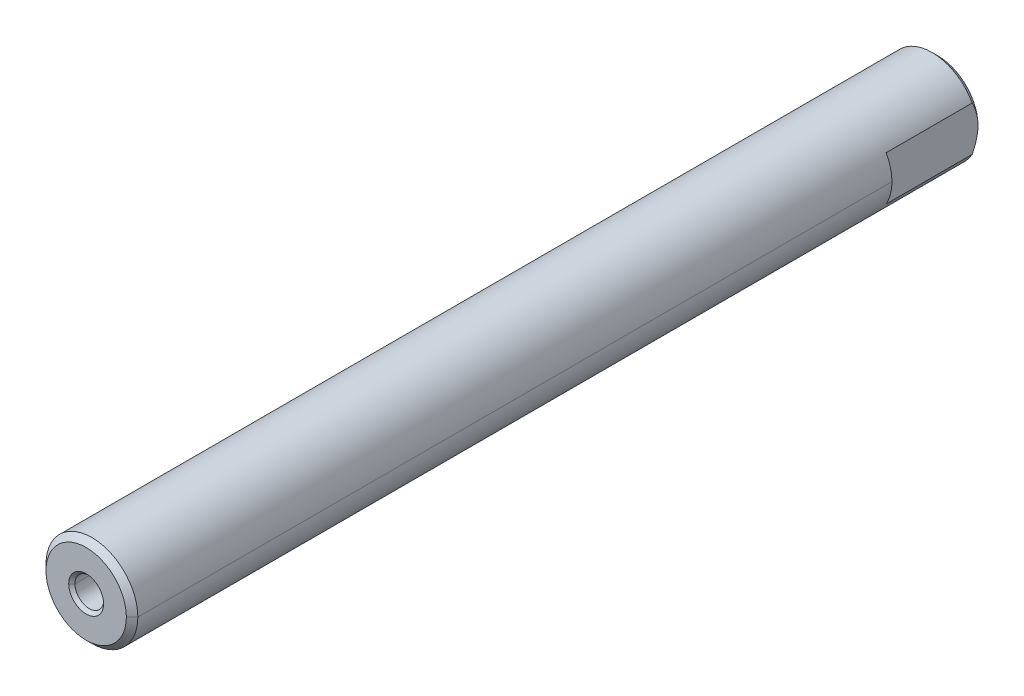
ISO-10303-21;
HEADER;
FILE_DESCRIPTION(('STEP AP214'),'2;1');
FILE_NAME('part.step','',(''),(''),'','','');
FILE_SCHEMA(('AUTOMOTIVE_DESIGN { 1 0 10303 214 1 1 1 1 }'));
ENDSEC;
DATA;
#1=APPLICATION_CONTEXT('core data for automotive mechanical design processes');
#2=APPLICATION_PROTOCOL_DEFINITION('international standard','automotive_design',2000,#1);
#3=PRODUCT_CONTEXT('',#1,'mechanical');
#4=PRODUCT('Part','Part','',(#3));
#5=PRODUCT_RELATED_PRODUCT_CATEGORY('part','',(#4));
#6=PRODUCT_DEFINITION_FORMATION('','',#4);
#7=PRODUCT_DEFINITION_CONTEXT('part definition',#1,'design');
#8=PRODUCT_DEFINITION('design','',#6,#7);
#9=PRODUCT_DEFINITION_SHAPE('','',#8);
#10=(LENGTH_UNIT() NAMED_UNIT(*) SI_UNIT(.MILLI.,.METRE.));
#11=(NAMED_UNIT(*) PLANE_ANGLE_UNIT() SI_UNIT($,.RADIAN.));
#12=(NAMED_UNIT(*) SI_UNIT($,.STERADIAN.) SOLID_ANGLE_UNIT());
#13=UNCERTAINTY_MEASURE_WITH_UNIT(LENGTH_MEASURE(1.E-05),#10,'distance_accuracy_value','');
#14=(GEOMETRIC_REPRESENTATION_CONTEXT(3) GLOBAL_UNCERTAINTY_ASSIGNED_CONTEXT((#13)) GLOBAL_UNIT_ASSIGNED_CONTEXT((#10,
#11,#12)) REPRESENTATION_CONTEXT('',''));
#15=CARTESIAN_POINT('',(0.,0.,0.));
#16=DIRECTION('',(0.,0.,1.));
#17=DIRECTION('',(1.,0.,0.));
#18=AXIS2_PLACEMENT_3D('',#15,#16,#17);
#19=CARTESIAN_POINT('',(3.5,4.88621935412864,8.));
#20=DIRECTION('',(1.,0.,0.));
#21=DIRECTION('',(0.,-1.,0.));
#22=AXIS2_PLACEMENT_3D('',#19,#20,#21);
#23=PLANE('',#22);
#24=DIRECTION('',(0.,0.,-1.));
#25=VECTOR('',#24,1.);
#26=CARTESIAN_POINT('',(3.5,-1.93649167310371,74.2));
#27=LINE('',#26,#25);
#28=CARTESIAN_POINT('',(3.5,-1.93649167310371,8.));
#29=VERTEX_POINT('',#28);
#30=CARTESIAN_POINT('',(3.5,-1.93649167310371,0.499999999999973));
#31=VERTEX_POINT('',#30);
#32=EDGE_CURVE('E265',#29,#31,#27,.T.);
#33=ORIENTED_EDGE('',*,*,#32,.T.);
#34=CARTESIAN_POINT('',(3.50000000000001,0.,0.));
#35=CARTESIAN_POINT('',(3.49999423419563,-0.0555619538931981,-1.30702272804487E-05));
#36=CARTESIAN_POINT('',(3.49999572668385,-0.111121671783046,0.00131852479239465));
#37=CARTESIAN_POINT('',(3.50000799050671,-0.222251276917325,0.00661908997412815));
#38=CARTESIAN_POINT('',(3.50001878444004,-0.277820859117804,0.0105944780899242));
#39=CARTESIAN_POINT('',(3.50004450680793,-0.389217556622177,0.0211781292324958));
#40=CARTESIAN_POINT('',(3.50005947197903,-0.44504241252961,0.027810026398505));
#41=CARTESIAN_POINT('',(3.5000592182873,-0.555633468361458,0.0434708609194682));
#42=CARTESIAN_POINT('',(3.50004437853917,-0.610404130825067,0.0524684418747022));
#43=CARTESIAN_POINT('',(3.50001919201908,-0.719999500201629,0.0728991674521169));
#44=CARTESIAN_POINT('',(3.50000888698394,-0.774820237879889,0.0843535501567228));
#45=CARTESIAN_POINT('',(3.50000115732277,-0.884720239033222,0.109686665736703));
#46=CARTESIAN_POINT('',(3.50000391844677,-0.939792043412603,0.123597637422184));
#47=CARTESIAN_POINT('',(3.4999962999565,-1.04630054982994,0.152703499743443));
#48=CARTESIAN_POINT('',(3.49998664419242,-1.09776877426685,0.167783612006304));
#49=CARTESIAN_POINT('',(3.49996326392631,-1.20089778451889,0.199927441463297));
#50=CARTESIAN_POINT('',(3.49994948262978,-1.25255060021617,0.217016680077174));
#51=CARTESIAN_POINT('',(3.49993156376901,-1.35617637628908,0.253176782737059));
#52=CARTESIAN_POINT('',(3.49992760005002,-1.40813899390018,0.272277208932558));
#53=CARTESIAN_POINT('',(3.49993019638396,-1.51250518018962,0.312455524133317));
#54=CARTESIAN_POINT('',(3.49993697160376,-1.56489630237242,0.333565673389017));
#55=CARTESIAN_POINT('',(3.49995658221961,-1.67023045290739,0.377760651519771));
#56=CARTESIAN_POINT('',(3.49996955094998,-1.72315924712703,0.400879296630532));
#57=CARTESIAN_POINT('',(3.49999114662072,-1.8296726293535,0.449092869420737));
#58=CARTESIAN_POINT('',(3.49999965968975,-1.88324162537189,0.474222290336471));
#59=CARTESIAN_POINT('',(3.5,-1.9364916731037,0.499999999999973));
#60=B_SPLINE_CURVE_WITH_KNOTS('',3,(#34,#35,#36,#37,#38,#39,#40,#41,#42,#43,#44,#45,#46,#47,#48,
#49,#50,#51,#52,#53,#54,#55,#56,#57,#58,#59),.UNSPECIFIED.,.F.,.F.,(4,2,2,2,2,2,2,2,2,2,2,2,4),
(0.,0.166666050409908,0.333738175953032,0.50233093054408,0.668792788664151,0.836756231229519,
1.00711457609173,1.16797762335634,1.33116587893333,1.49722377747284,1.66665111117858,
1.83990264037783,2.01738884059159),.UNSPECIFIED.);
#61=CARTESIAN_POINT('',(3.5,0.,0.));
#62=VERTEX_POINT('',#61);
#63=EDGE_CURVE('E51',#62,#31,#60,.T.);
#64=ORIENTED_EDGE('',*,*,#63,.F.);
#65=CARTESIAN_POINT('',(3.49999999999964,1.93649167310487,0.50000000000022));
#66=CARTESIAN_POINT('',(3.49999633796739,1.85725073251925,0.461643561513582));
#67=CARTESIAN_POINT('',(3.49998014987614,1.77729228376843,0.424713309217899));
#68=CARTESIAN_POINT('',(3.49994945600058,1.61864369550092,0.355478896279895));
#69=CARTESIAN_POINT('',(3.49993491163559,1.54000355663815,0.323059791368621));
#70=CARTESIAN_POINT('',(3.49993056595057,1.38363011274416,0.262831423625443));
#71=CARTESIAN_POINT('',(3.49994004639097,1.30593864552105,0.234914272908432));
#72=CARTESIAN_POINT('',(3.49998004272987,1.15106355267432,0.183693271237866));
#73=CARTESIAN_POINT('',(3.50001005861703,1.07391096267743,0.160296356994423));
#74=CARTESIAN_POINT('',(3.49999457224081,0.954244897451044,0.12752215635419));
#75=CARTESIAN_POINT('',(3.49997747550548,0.912136997920225,0.116649537344117));
#76=CARTESIAN_POINT('',(3.49992408533141,0.828273762023762,0.0963700135038604));
#77=CARTESIAN_POINT('',(3.49988810032696,0.786523409588376,0.0869426158519951));
#78=CARTESIAN_POINT('',(3.49982274348452,0.70328576035035,0.0695567359411578));
#79=CARTESIAN_POINT('',(3.49979329148949,0.661802138465579,0.0615806933900689));
#80=CARTESIAN_POINT('',(3.49975199189934,0.579005667526155,0.0470927424214977));
#81=CARTESIAN_POINT('',(3.49973997165639,0.537695241671709,0.0405670248487049));
#82=CARTESIAN_POINT('',(3.49973858613407,0.455150110797609,0.0289762346599651));
#83=CARTESIAN_POINT('',(3.49974907048804,0.413916734200623,0.0239017225160791));
#84=CARTESIAN_POINT('',(3.49978885777352,0.331428306804682,0.015208336579315));
#85=CARTESIAN_POINT('',(3.4998181011143,0.290173736525271,0.0115849121837062));
#86=CARTESIAN_POINT('',(3.49988377923512,0.207543637941627,0.00578988180787202));
#87=CARTESIAN_POINT('',(3.49992021733093,0.166168062565514,0.0036189472500192));
#88=CARTESIAN_POINT('',(3.49997761254116,0.0831949939432194,0.000719101244980721));
#89=CARTESIAN_POINT('',(3.49999850500249,0.0415972906389801,-3.80881945210407E-06));
#90=CARTESIAN_POINT('',(3.50000000000001,0.,0.));
#91=B_SPLINE_CURVE_WITH_KNOTS('',3,(#65,#66,#67,#68,#69,#70,#71,#72,#73,#74,#75,#76,#77,#78,#79,
#80,#81,#82,#83,#84,#85,#86,#87,#88,#89,#90),.UNSPECIFIED.,.F.,.F.,(4,2,2,2,2,2,2,2,2,2,2,2,4),
(0.,0.264129868688764,0.519235667288116,0.76680540986096,1.00855216360746,1.13900182260933,
1.26738470409587,1.39409256107915,1.51953669763116,1.64414527718691,1.76835996604413,
1.89263203430834,2.01741809508854),.UNSPECIFIED.);
#92=CARTESIAN_POINT('',(3.5,1.93649167310507,0.499999999999808));
#93=VERTEX_POINT('',#92);
#94=EDGE_CURVE('E264',#93,#62,#91,.T.);
#95=ORIENTED_EDGE('',*,*,#94,.F.);
#96=DIRECTION('',(0.,0.,1.));
#97=VECTOR('',#96,1.);
#98=CARTESIAN_POINT('',(3.5,1.93649167310371,74.2));
#99=LINE('',#98,#97);
#100=CARTESIAN_POINT('',(3.5,1.93649167310371,8.));
#101=VERTEX_POINT('',#100);
#102=EDGE_CURVE('E243',#93,#101,#99,.T.);
#103=ORIENTED_EDGE('',*,*,#102,.T.);
#104=DIRECTION('',(0.,-1.,0.));
#105=VECTOR('',#104,1.);
#106=CARTESIAN_POINT('',(3.5,4.88621935412864,8.));
#107=LINE('',#106,#105);
#108=EDGE_CURVE('E9',#101,#29,#107,.T.);
#109=ORIENTED_EDGE('',*,*,#108,.T.);
#110=EDGE_LOOP('',(#33,#64,#95,#103,#109));
#111=FACE_BOUND('',#110,.T.);
#112=ADVANCED_FACE('F15',(#111),#23,.T.);
#113=CARTESIAN_POINT('',(0.,0.,8.));
#114=DIRECTION('',(0.,0.,-1.));
#115=DIRECTION('',(0.,-1.,0.));
#116=AXIS2_PLACEMENT_3D('',#113,#114,#115);
#117=PLANE('',#116);
#118=CARTESIAN_POINT('',(0.,0.,8.));
#119=DIRECTION('',(0.,0.,-1.));
#120=DIRECTION('',(-1.,0.,0.));
#121=AXIS2_PLACEMENT_3D('',#118,#119,#120);
#122=CIRCLE('',#121,4.);
#123=CARTESIAN_POINT('',(4.,0.,8.));
#124=VERTEX_POINT('',#123);
#125=EDGE_CURVE('E239',#101,#124,#122,.T.);
#126=ORIENTED_EDGE('',*,*,#125,.T.);
#127=CARTESIAN_POINT('',(0.,0.,8.));
#128=DIRECTION('',(0.,0.,-1.));
#129=DIRECTION('',(-1.,0.,0.));
#130=AXIS2_PLACEMENT_3D('',#127,#128,#129);
#131=CIRCLE('',#130,4.);
#132=EDGE_CURVE('E260',#124,#29,#131,.T.);
#133=ORIENTED_EDGE('',*,*,#132,.T.);
#134=ORIENTED_EDGE('',*,*,#108,.F.);
#135=EDGE_LOOP('',(#126,#133,#134));
#136=FACE_BOUND('',#135,.T.);
#137=ADVANCED_FACE('F446',(#136),#117,.T.);
#138=CARTESIAN_POINT('',(0.,0.,8.));
#139=DIRECTION('',(0.,0.,-1.));
#140=DIRECTION('',(0.,-1.,0.));
#141=AXIS2_PLACEMENT_3D('',#138,#139,#140);
#142=PLANE('',#141);
#143=CARTESIAN_POINT('',(0.,0.,8.));
#144=DIRECTION('',(0.,0.,-1.));
#145=DIRECTION('',(-1.,0.,0.));
#146=AXIS2_PLACEMENT_3D('',#143,#144,#145);
#147=CIRCLE('',#146,4.);
#148=CARTESIAN_POINT('',(-3.5,-1.93649167310371,8.));
#149=VERTEX_POINT('',#148);
#150=CARTESIAN_POINT('',(-4.,0.,8.));
#151=VERTEX_POINT('',#150);
#152=EDGE_CURVE('E256',#149,#151,#147,.T.);
#153=ORIENTED_EDGE('',*,*,#152,.T.);
#154=CARTESIAN_POINT('',(0.,0.,8.));
#155=DIRECTION('',(0.,0.,-1.));
#156=DIRECTION('',(-1.,0.,0.));
#157=AXIS2_PLACEMENT_3D('',#154,#155,#156);
#158=CIRCLE('',#157,4.);
#159=CARTESIAN_POINT('',(-3.5,1.93649167310371,8.));
#160=VERTEX_POINT('',#159);
#161=EDGE_CURVE('E244',#151,#160,#158,.T.);
#162=ORIENTED_EDGE('',*,*,#161,.T.);
#163=DIRECTION('',(0.,1.,0.));
#164=VECTOR('',#163,1.);
#165=CARTESIAN_POINT('',(-3.5,4.88621935412864,8.));
#166=LINE('',#165,#164);
#167=EDGE_CURVE('E25',#149,#160,#166,.T.);
#168=ORIENTED_EDGE('',*,*,#167,.F.);
#169=EDGE_LOOP('',(#153,#162,#168));
#170=FACE_BOUND('',#169,.T.);
#171=ADVANCED_FACE('F407',(#170),#142,.T.);
#172=CARTESIAN_POINT('',(-3.5,4.88621935412864,8.));
#173=DIRECTION('',(-1.,0.,0.));
#174=DIRECTION('',(0.,0.,1.));
#175=AXIS2_PLACEMENT_3D('',#172,#173,#174);
#176=PLANE('',#175);
#177=DIRECTION('',(0.,0.,-1.));
#178=VECTOR('',#177,1.);
#179=CARTESIAN_POINT('',(-3.5,1.93649167310371,74.2));
#180=LINE('',#179,#178);
#181=CARTESIAN_POINT('',(-3.5,1.93649167310371,0.499999999999973));
#182=VERTEX_POINT('',#181);
#183=EDGE_CURVE('E249',#160,#182,#180,.T.);
#184=ORIENTED_EDGE('',*,*,#183,.T.);
#185=CARTESIAN_POINT('',(-3.50000000000001,0.,0.));
#186=CARTESIAN_POINT('',(-3.49999423419563,0.05556195389349,-1.3070227285935E-05));
#187=CARTESIAN_POINT('',(-3.49999572668383,0.111121671783623,0.00131852479238515));
#188=CARTESIAN_POINT('',(-3.50000799050666,0.222251276918185,0.00661908997412416));
#189=CARTESIAN_POINT('',(-3.50001878443996,0.277820859118661,0.0105944780899161));
#190=CARTESIAN_POINT('',(-3.50004450680784,0.389217556622746,0.021178129232478));
#191=CARTESIAN_POINT('',(-3.50005947197896,0.445042412529893,0.0278100263984686));
#192=CARTESIAN_POINT('',(-3.50005921828738,0.555633468359552,0.0434708609192792));
#193=CARTESIAN_POINT('',(-3.50004437853941,0.610404130821268,0.0524684418743068));
#194=CARTESIAN_POINT('',(-3.50001919201962,0.719999500195927,0.0728991674514993));
#195=CARTESIAN_POINT('',(-3.50000888698464,0.774820237874163,0.0843535501561695));
#196=CARTESIAN_POINT('',(-3.50000115732337,0.884720239029402,0.109686665736321));
#197=CARTESIAN_POINT('',(-3.5000039184471,0.939792043410694,0.123597637421981));
#198=CARTESIAN_POINT('',(-3.49999629995618,1.04630054982861,0.152703499742774));
#199=CARTESIAN_POINT('',(-3.49998664419173,1.09776877426421,0.167783612004871));
#200=CARTESIAN_POINT('',(-3.49996326392519,1.20089778451411,0.199927441460693));
#201=CARTESIAN_POINT('',(-3.49994948262861,1.25255060021055,0.217016680074183));
#202=CARTESIAN_POINT('',(-3.49993156376785,1.3561763762823,0.253176782733528));
#203=CARTESIAN_POINT('',(-3.49992760004892,1.40813899389308,0.272277208928893));
#204=CARTESIAN_POINT('',(-3.49993019638307,1.51250518018245,0.312455524129651));
#205=CARTESIAN_POINT('',(-3.49993697160302,1.56489630236548,0.333565673385505));
#206=CARTESIAN_POINT('',(-3.49995658221916,1.6702304529015,0.377760651516822));
#207=CARTESIAN_POINT('',(-3.49996955094968,1.72315924712196,0.400879296628012));
#208=CARTESIAN_POINT('',(-3.49999114662065,1.82967262935066,0.449092869419339));
#209=CARTESIAN_POINT('',(-3.49999965968974,1.88324162537047,0.474222290335783));
#210=CARTESIAN_POINT('',(-3.5,1.93649167310371,0.499999999999973));
#211=B_SPLINE_CURVE_WITH_KNOTS('',3,(#185,#186,#187,#188,#189,#190,#191,#192,#193,#194,#195,
#196,#197,#198,#199,#200,#201,#202,#203,#204,#205,#206,#207,#208,#209,#210),.UNSPECIFIED.,.F.,
.F.,(4,2,2,2,2,2,2,2,2,2,2,2,4),(0.,0.166666050410762,0.333738175953879,0.502330930544067,
0.668792788658431,0.836756231223779,1.0071145760917,1.1679776233519,1.33116587892611,
1.49722377746459,1.66665111117115,1.83990264037315,2.01738884059166),.UNSPECIFIED.);
#212=CARTESIAN_POINT('',(-3.5,0.,0.));
#213=VERTEX_POINT('',#212);
#214=EDGE_CURVE('E334',#213,#182,#211,.T.);
#215=ORIENTED_EDGE('',*,*,#214,.F.);
#216=CARTESIAN_POINT('',(-3.49999999999964,-1.93649167310488,0.500000000000221));
#217=CARTESIAN_POINT('',(-3.49999633796739,-1.85725073252099,0.461643561514421));
#218=CARTESIAN_POINT('',(-3.4999801498763,-1.77729228377189,0.424713309219631));
#219=CARTESIAN_POINT('',(-3.49994945600111,-1.61864369550664,0.355478896282779));
#220=CARTESIAN_POINT('',(-3.49993491163634,-1.54000355664437,0.323059791371818));
#221=CARTESIAN_POINT('',(-3.49993056595163,-1.38363011275029,0.262831423628666));
#222=CARTESIAN_POINT('',(-3.49994004639212,-1.30593864552655,0.234914272911425));
#223=CARTESIAN_POINT('',(-3.49998004273072,-1.15106355267759,0.183693271239671));
#224=CARTESIAN_POINT('',(-3.5000100586175,-1.07391096267908,0.160296356995333));
#225=CARTESIAN_POINT('',(-3.49999457224055,-0.954244897452035,0.127522156354212));
#226=CARTESIAN_POINT('',(-3.49997747550493,-0.912136997922215,0.116649537344102));
#227=CARTESIAN_POINT('',(-3.49992408533048,-0.828273762027455,0.0963700135038158));
#228=CARTESIAN_POINT('',(-3.49988810032593,-0.786523409592771,0.0869426158519643));
#229=CARTESIAN_POINT('',(-3.49982274348338,-0.703285760355872,0.0695567359411342));
#230=CARTESIAN_POINT('',(-3.49979329148834,-0.661802138471524,0.0615806933900465));
#231=CARTESIAN_POINT('',(-3.49975199189823,-0.579005667532664,0.0470927424214731));
#232=CARTESIAN_POINT('',(-3.49973997165535,-0.53769524167836,0.0405670248486853));
#233=CARTESIAN_POINT('',(-3.49973858613319,-0.455150110804259,0.0289762346599458));
#234=CARTESIAN_POINT('',(-3.49974907048726,-0.413916734207131,0.0239017225160643));
#235=CARTESIAN_POINT('',(-3.49978885777295,-0.331428306810625,0.0152083365793001));
#236=CARTESIAN_POINT('',(-3.49981810111383,-0.29017373653079,0.0115849121836963));
#237=CARTESIAN_POINT('',(-3.49988377923486,-0.207543637946015,0.00578988180786212));
#238=CARTESIAN_POINT('',(-3.49992021733076,-0.166168062569196,0.00361894725001425));
#239=CARTESIAN_POINT('',(-3.49997761254112,-0.0831949939452048,0.000719101244975897));
#240=CARTESIAN_POINT('',(-3.49999850500249,-0.0415972906399759,-3.80881945189513E-06));
#241=CARTESIAN_POINT('',(-3.50000000000001,0.,0.));
#242=B_SPLINE_CURVE_WITH_KNOTS('',3,(#216,#217,#218,#219,#220,#221,#222,#223,#224,#225,#226,
#227,#228,#229,#230,#231,#232,#233,#234,#235,#236,#237,#238,#239,#240,#241),.UNSPECIFIED.,.F.,
.F.,(4,2,2,2,2,2,2,2,2,2,2,2,4),(0.,0.264129868682963,0.519235667280543,0.7668054098554,
1.00855216360737,1.13900182260636,1.26738470409083,1.39409256107287,1.51953669762445,
1.64414527718062,1.76835996603911,1.89263203430544,2.01741809508861),.UNSPECIFIED.);
#243=CARTESIAN_POINT('',(-3.5,-1.93649167310507,0.499999999999808));
#244=VERTEX_POINT('',#243);
#245=EDGE_CURVE('E39',#244,#213,#242,.T.);
#246=ORIENTED_EDGE('',*,*,#245,.F.);
#247=DIRECTION('',(0.,0.,1.));
#248=VECTOR('',#247,1.);
#249=CARTESIAN_POINT('',(-3.5,-1.93649167310371,74.2));
#250=LINE('',#249,#248);
#251=EDGE_CURVE('E259',#244,#149,#250,.T.);
#252=ORIENTED_EDGE('',*,*,#251,.T.);
#253=ORIENTED_EDGE('',*,*,#167,.T.);
#254=EDGE_LOOP('',(#184,#215,#246,#252,#253));
#255=FACE_BOUND('',#254,.T.);
#256=ADVANCED_FACE('F396',(#255),#176,.T.);
#257=CARTESIAN_POINT('',(0.,0.,74.2));
#258=DIRECTION('',(0.,0.,-1.));
#259=DIRECTION('',(-1.,0.,0.));
#260=AXIS2_PLACEMENT_3D('',#257,#258,#259);
#261=CONICAL_SURFACE('',#260,3.5,0.785398163397438);
#262=DIRECTION('',(0.70710678118654,0.,-0.707106781186555));
#263=VECTOR('',#262,1.);
#264=CARTESIAN_POINT('',(3.5,0.,74.2));
#265=LINE('',#264,#263);
#266=CARTESIAN_POINT('',(3.5,0.,74.2));
#267=VERTEX_POINT('',#266);
#268=CARTESIAN_POINT('',(4.,0.,73.7));
#269=VERTEX_POINT('',#268);
#270=EDGE_CURVE('E825',#267,#269,#265,.T.);
#271=ORIENTED_EDGE('',*,*,#270,.F.);
#272=CARTESIAN_POINT('',(0.,0.,74.2));
#273=DIRECTION('',(0.,0.,1.));
#274=DIRECTION('',(1.,0.,0.));
#275=AXIS2_PLACEMENT_3D('',#272,#273,#274);
#276=CIRCLE('',#275,3.5);
#277=CARTESIAN_POINT('',(-3.5,0.,74.2));
#278=VERTEX_POINT('',#277);
#279=EDGE_CURVE('E269',#278,#267,#276,.T.);
#280=ORIENTED_EDGE('',*,*,#279,.F.);
#281=DIRECTION('',(-0.70710678118654,0.,-0.707106781186555));
#282=VECTOR('',#281,1.);
#283=CARTESIAN_POINT('',(-3.5,0.,74.2));
#284=LINE('',#283,#282);
#285=CARTESIAN_POINT('',(-4.,0.,73.7));
#286=VERTEX_POINT('',#285);
#287=EDGE_CURVE('E194',#278,#286,#284,.T.);
#288=ORIENTED_EDGE('',*,*,#287,.T.);
#289=CARTESIAN_POINT('',(0.,0.,73.7));
#290=DIRECTION('',(0.,0.,-1.));
#291=DIRECTION('',(1.,0.,0.));
#292=AXIS2_PLACEMENT_3D('',#289,#290,#291);
#293=CIRCLE('',#292,4.);
#294=EDGE_CURVE('E253',#269,#286,#293,.T.);
#295=ORIENTED_EDGE('',*,*,#294,.F.);
#296=EDGE_LOOP('',(#271,#280,#288,#295));
#297=FACE_BOUND('',#296,.T.);
#298=ADVANCED_FACE('F406',(#297),#261,.T.);
#299=CARTESIAN_POINT('',(0.,0.,73.9295));
#300=DIRECTION('',(0.,0.,1.));
#301=DIRECTION('',(1.,0.,0.));
#302=AXIS2_PLACEMENT_3D('',#299,#300,#301);
#303=CONICAL_SURFACE('',#302,1.25,0.785398163397412);
#304=DIRECTION('',(-0.707106781186522,0.,0.707106781186573));
#305=VECTOR('',#304,1.);
#306=CARTESIAN_POINT('',(-1.25,0.,73.9295));
#307=LINE('',#306,#305);
#308=CARTESIAN_POINT('',(-1.25,0.,73.9295));
#309=VERTEX_POINT('',#308);
#310=CARTESIAN_POINT('',(-1.5205,0.,74.2));
#311=VERTEX_POINT('',#310);
#312=EDGE_CURVE('E164',#309,#311,#307,.T.);
#313=ORIENTED_EDGE('',*,*,#312,.F.);
#314=CARTESIAN_POINT('',(0.,0.,73.9295));
#315=DIRECTION('',(0.,0.,1.));
#316=DIRECTION('',(1.,0.,0.));
#317=AXIS2_PLACEMENT_3D('',#314,#315,#316);
#318=CIRCLE('',#317,1.25);
#319=CARTESIAN_POINT('',(1.25,0.,73.9295));
#320=VERTEX_POINT('',#319);
#321=EDGE_CURVE('E157',#320,#309,#318,.T.);
#322=ORIENTED_EDGE('',*,*,#321,.F.);
#323=DIRECTION('',(0.707106781186522,0.,0.707106781186573));
#324=VECTOR('',#323,1.);
#325=CARTESIAN_POINT('',(1.25,0.,73.9295));
#326=LINE('',#325,#324);
#327=CARTESIAN_POINT('',(1.5205,0.,74.2));
#328=VERTEX_POINT('',#327);
#329=EDGE_CURVE('E161',#320,#328,#326,.T.);
#330=ORIENTED_EDGE('',*,*,#329,.T.);
#331=CARTESIAN_POINT('',(0.,0.,74.2));
#332=DIRECTION('',(0.,0.,-1.));
#333=DIRECTION('',(1.,0.,0.));
#334=AXIS2_PLACEMENT_3D('',#331,#332,#333);
#335=CIRCLE('',#334,1.5205);
#336=EDGE_CURVE('E272',#311,#328,#335,.T.);
#337=ORIENTED_EDGE('',*,*,#336,.F.);
#338=EDGE_LOOP('',(#313,#322,#330,#337));
#339=FACE_BOUND('',#338,.T.);
#340=ADVANCED_FACE('F159',(#339),#303,.F.);
#341=CARTESIAN_POINT('',(0.,0.,0.));
#342=DIRECTION('',(0.,0.,-1.));
#343=DIRECTION('',(-1.,0.,0.));
#344=AXIS2_PLACEMENT_3D('',#341,#342,#343);
#345=CONICAL_SURFACE('',#344,1.5205,0.785398163397453);
#346=DIRECTION('',(0.707106781186551,0.,-0.707106781186544));
#347=VECTOR('',#346,1.);
#348=CARTESIAN_POINT('',(1.5205,0.,0.));
#349=LINE('',#348,#347);
#350=CARTESIAN_POINT('',(1.25,0.,0.270500000000005));
#351=VERTEX_POINT('',#350);
#352=CARTESIAN_POINT('',(1.5205,0.,0.));
#353=VERTEX_POINT('',#352);
#354=EDGE_CURVE('E210',#351,#353,#349,.T.);
#355=ORIENTED_EDGE('',*,*,#354,.F.);
#356=CARTESIAN_POINT('',(0.,0.,0.270500000000005));
#357=DIRECTION('',(0.,0.,-1.));
#358=DIRECTION('',(1.,0.,0.));
#359=AXIS2_PLACEMENT_3D('',#356,#357,#358);
#360=CIRCLE('',#359,1.25);
#361=CARTESIAN_POINT('',(-1.25,0.,0.270500000000005));
#362=VERTEX_POINT('',#361);
#363=EDGE_CURVE('E268',#362,#351,#360,.T.);
#364=ORIENTED_EDGE('',*,*,#363,.F.);
#365=DIRECTION('',(-0.707106781186551,0.,-0.707106781186544));
#366=VECTOR('',#365,1.);
#367=CARTESIAN_POINT('',(-1.5205,0.,0.));
#368=LINE('',#367,#366);
#369=CARTESIAN_POINT('',(-1.5205,0.,0.));
#370=VERTEX_POINT('',#369);
#371=EDGE_CURVE('E209',#362,#370,#368,.T.);
#372=ORIENTED_EDGE('',*,*,#371,.T.);
#373=CARTESIAN_POINT('',(0.,0.,0.));
#374=DIRECTION('',(0.,0.,1.));
#375=DIRECTION('',(1.,0.,0.));
#376=AXIS2_PLACEMENT_3D('',#373,#374,#375);
#377=CIRCLE('',#376,1.5205);
#378=EDGE_CURVE('E275',#353,#370,#377,.T.);
#379=ORIENTED_EDGE('',*,*,#378,.F.);
#380=EDGE_LOOP('',(#355,#364,#372,#379));
#381=FACE_BOUND('',#380,.T.);
#382=ADVANCED_FACE('F521',(#381),#345,.F.);
#383=CARTESIAN_POINT('',(0.,0.,8.29014784));
#384=DIRECTION('',(0.,0.,1.));
#385=DIRECTION('',(1.,0.,0.));
#386=AXIS2_PLACEMENT_3D('',#383,#384,#385);
#387=PLANE('',#386);
#388=CARTESIAN_POINT('',(0.,0.,8.29014784));
#389=DIRECTION('',(0.,0.,1.));
#390=DIRECTION('',(1.,0.,0.));
#391=AXIS2_PLACEMENT_3D('',#388,#389,#390);
#392=CIRCLE('',#391,1.25);
#393=CARTESIAN_POINT('',(-1.25,0.,8.29014784));
#394=VERTEX_POINT('',#393);
#395=CARTESIAN_POINT('',(1.25,0.,8.29014784));
#396=VERTEX_POINT('',#395);
#397=EDGE_CURVE('E220',#394,#396,#392,.T.);
#398=ORIENTED_EDGE('',*,*,#397,.F.);
#399=CARTESIAN_POINT('',(0.,0.,8.29014784));
#400=DIRECTION('',(0.,0.,1.));
#401=DIRECTION('',(1.,0.,0.));
#402=AXIS2_PLACEMENT_3D('',#399,#400,#401);
#403=CIRCLE('',#402,1.25);
#404=EDGE_CURVE('E170',#396,#394,#403,.T.);
#405=ORIENTED_EDGE('',*,*,#404,.F.);
#406=EDGE_LOOP('',(#398,#405));
#407=FACE_BOUND('',#406,.T.);
#408=ADVANCED_FACE('F530',(#407),#387,.F.);
#409=CARTESIAN_POINT('',(0.,0.,8.29014784));
#410=DIRECTION('',(0.,0.,-1.));
#411=DIRECTION('',(-1.,0.,0.));
#412=AXIS2_PLACEMENT_3D('',#409,#410,#411);
#413=CYLINDRICAL_SURFACE('',#412,1.25);
#414=DIRECTION('',(0.,0.,-1.));
#415=VECTOR('',#414,1.);
#416=CARTESIAN_POINT('',(1.25,0.,8.29014784));
#417=LINE('',#416,#415);
#418=EDGE_CURVE('E215',#396,#351,#417,.T.);
#419=ORIENTED_EDGE('',*,*,#418,.F.);
#420=ORIENTED_EDGE('',*,*,#404,.T.);
#421=DIRECTION('',(0.,0.,-1.));
#422=VECTOR('',#421,1.);
#423=CARTESIAN_POINT('',(-1.25,0.,8.29014784));
#424=LINE('',#423,#422);
#425=EDGE_CURVE('E219',#394,#362,#424,.T.);
#426=ORIENTED_EDGE('',*,*,#425,.T.);
#427=ORIENTED_EDGE('',*,*,#363,.T.);
#428=EDGE_LOOP('',(#419,#420,#426,#427));
#429=FACE_BOUND('',#428,.T.);
#430=ADVANCED_FACE('F525',(#429),#413,.F.);
#431=CARTESIAN_POINT('',(0.,0.,65.90985216));
#432=DIRECTION('',(0.,0.,1.));
#433=DIRECTION('',(1.,0.,0.));
#434=AXIS2_PLACEMENT_3D('',#431,#432,#433);
#435=PLANE('',#434);
#436=CARTESIAN_POINT('',(0.,0.,65.90985216));
#437=DIRECTION('',(0.,0.,1.));
#438=DIRECTION('',(1.,0.,0.));
#439=AXIS2_PLACEMENT_3D('',#436,#437,#438);
#440=CIRCLE('',#439,1.25);
#441=CARTESIAN_POINT('',(1.25,0.,65.90985216));
#442=VERTEX_POINT('',#441);
#443=CARTESIAN_POINT('',(-1.25,0.,65.90985216));
#444=VERTEX_POINT('',#443);
#445=EDGE_CURVE('E171',#442,#444,#440,.T.);
#446=ORIENTED_EDGE('',*,*,#445,.T.);
#447=CARTESIAN_POINT('',(0.,0.,65.90985216));
#448=DIRECTION('',(0.,0.,1.));
#449=DIRECTION('',(1.,0.,0.));
#450=AXIS2_PLACEMENT_3D('',#447,#448,#449);
#451=CIRCLE('',#450,1.25);
#452=EDGE_CURVE('E233',#444,#442,#451,.T.);
#453=ORIENTED_EDGE('',*,*,#452,.T.);
#454=EDGE_LOOP('',(#446,#453));
#455=FACE_BOUND('',#454,.T.);
#456=ADVANCED_FACE('F529',(#455),#435,.T.);
#457=CARTESIAN_POINT('',(0.,0.,65.90985216));
#458=DIRECTION('',(0.,0.,1.));
#459=DIRECTION('',(1.,0.,0.));
#460=AXIS2_PLACEMENT_3D('',#457,#458,#459);
#461=CYLINDRICAL_SURFACE('',#460,1.25);
#462=DIRECTION('',(0.,0.,1.));
#463=VECTOR('',#462,1.);
#464=CARTESIAN_POINT('',(-1.25,0.,65.90985216));
#465=LINE('',#464,#463);
#466=EDGE_CURVE('E182',#444,#309,#465,.T.);
#467=ORIENTED_EDGE('',*,*,#466,.F.);
#468=ORIENTED_EDGE('',*,*,#445,.F.);
#469=DIRECTION('',(0.,0.,1.));
#470=VECTOR('',#469,1.);
#471=CARTESIAN_POINT('',(1.25,0.,65.90985216));
#472=LINE('',#471,#470);
#473=EDGE_CURVE('E174',#442,#320,#472,.T.);
#474=ORIENTED_EDGE('',*,*,#473,.T.);
#475=ORIENTED_EDGE('',*,*,#321,.T.);
#476=EDGE_LOOP('',(#467,#468,#474,#475));
#477=FACE_BOUND('',#476,.T.);
#478=ADVANCED_FACE('F175',(#477),#461,.F.);
#479=CARTESIAN_POINT('',(0.,0.,0.));
#480=DIRECTION('',(0.,0.,1.));
#481=DIRECTION('',(1.,0.,0.));
#482=AXIS2_PLACEMENT_3D('',#479,#480,#481);
#483=PLANE('',#482);
#484=CARTESIAN_POINT('',(0.,0.,0.));
#485=DIRECTION('',(0.,0.,1.));
#486=DIRECTION('',(1.,0.,0.));
#487=AXIS2_PLACEMENT_3D('',#484,#485,#486);
#488=CIRCLE('',#487,1.5205);
#489=EDGE_CURVE('E206',#370,#353,#488,.T.);
#490=ORIENTED_EDGE('',*,*,#489,.T.);
#491=ORIENTED_EDGE('',*,*,#378,.T.);
#492=EDGE_LOOP('',(#490,#491));
#493=FACE_BOUND('',#492,.T.);
#494=CARTESIAN_POINT('',(0.,0.,0.));
#495=DIRECTION('',(0.,0.,-1.));
#496=DIRECTION('',(1.,0.,0.));
#497=AXIS2_PLACEMENT_3D('',#494,#495,#496);
#498=CIRCLE('',#497,3.5);
#499=EDGE_CURVE('E429',#62,#213,#498,.T.);
#500=ORIENTED_EDGE('',*,*,#499,.T.);
#501=CARTESIAN_POINT('',(0.,0.,0.));
#502=DIRECTION('',(0.,0.,-1.));
#503=DIRECTION('',(1.,0.,0.));
#504=AXIS2_PLACEMENT_3D('',#501,#502,#503);
#505=CIRCLE('',#504,3.5);
#506=EDGE_CURVE('E434',#213,#62,#505,.T.);
#507=ORIENTED_EDGE('',*,*,#506,.T.);
#508=EDGE_LOOP('',(#500,#507));
#509=FACE_BOUND('',#508,.T.);
#510=ADVANCED_FACE('F546',(#493,#509),#483,.F.);
#511=CARTESIAN_POINT('',(0.,0.,74.2));
#512=DIRECTION('',(0.,0.,1.));
#513=DIRECTION('',(1.,0.,0.));
#514=AXIS2_PLACEMENT_3D('',#511,#512,#513);
#515=PLANE('',#514);
#516=CARTESIAN_POINT('',(0.,0.,74.2));
#517=DIRECTION('',(0.,0.,-1.));
#518=DIRECTION('',(1.,0.,0.));
#519=AXIS2_PLACEMENT_3D('',#516,#517,#518);
#520=CIRCLE('',#519,1.5205);
#521=EDGE_CURVE('E188',#328,#311,#520,.T.);
#522=ORIENTED_EDGE('',*,*,#521,.T.);
#523=ORIENTED_EDGE('',*,*,#336,.T.);
#524=EDGE_LOOP('',(#522,#523));
#525=FACE_BOUND('',#524,.T.);
#526=ORIENTED_EDGE('',*,*,#279,.T.);
#527=CARTESIAN_POINT('',(0.,0.,74.2));
#528=DIRECTION('',(0.,0.,1.));
#529=DIRECTION('',(1.,0.,0.));
#530=AXIS2_PLACEMENT_3D('',#527,#528,#529);
#531=CIRCLE('',#530,3.5);
#532=EDGE_CURVE('E843',#267,#278,#531,.T.);
#533=ORIENTED_EDGE('',*,*,#532,.T.);
#534=EDGE_LOOP('',(#526,#533));
#535=FACE_BOUND('',#534,.T.);
#536=ADVANCED_FACE('F300',(#525,#535),#515,.T.);
#537=CARTESIAN_POINT('',(0.,0.,0.499999999999973));
#538=DIRECTION('',(0.,0.,1.));
#539=DIRECTION('',(1.,0.,0.));
#540=AXIS2_PLACEMENT_3D('',#537,#538,#539);
#541=CONICAL_SURFACE('',#540,4.,0.785398163397452);
#542=ORIENTED_EDGE('',*,*,#499,.F.);
#543=ORIENTED_EDGE('',*,*,#63,.T.);
#544=CARTESIAN_POINT('',(0.,0.,0.499999999999973));
#545=DIRECTION('',(0.,0.,1.));
#546=DIRECTION('',(1.,0.,0.));
#547=AXIS2_PLACEMENT_3D('',#544,#545,#546);
#548=CIRCLE('',#547,4.);
#549=EDGE_CURVE('E326',#244,#31,#548,.T.);
#550=ORIENTED_EDGE('',*,*,#549,.F.);
#551=ORIENTED_EDGE('',*,*,#245,.T.);
#552=EDGE_LOOP('',(#542,#543,#550,#551));
#553=FACE_BOUND('',#552,.T.);
#554=ADVANCED_FACE('F289',(#553),#541,.T.);
#555=CARTESIAN_POINT('',(0.,0.,0.499999999999973));
#556=DIRECTION('',(0.,0.,1.));
#557=DIRECTION('',(1.,0.,0.));
#558=AXIS2_PLACEMENT_3D('',#555,#556,#557);
#559=CONICAL_SURFACE('',#558,4.,0.785398163397452);
#560=CARTESIAN_POINT('',(0.,0.,0.499999999999973));
#561=DIRECTION('',(0.,0.,1.));
#562=DIRECTION('',(1.,0.,0.));
#563=AXIS2_PLACEMENT_3D('',#560,#561,#562);
#564=CIRCLE('',#563,4.);
#565=EDGE_CURVE('E378',#93,#182,#564,.T.);
#566=ORIENTED_EDGE('',*,*,#565,.F.);
#567=ORIENTED_EDGE('',*,*,#94,.T.);
#568=ORIENTED_EDGE('',*,*,#506,.F.);
#569=ORIENTED_EDGE('',*,*,#214,.T.);
#570=EDGE_LOOP('',(#566,#567,#568,#569));
#571=FACE_BOUND('',#570,.T.);
#572=ADVANCED_FACE('F299',(#571),#559,.T.);
#573=CARTESIAN_POINT('',(0.,0.,74.2));
#574=DIRECTION('',(0.,0.,-1.));
#575=DIRECTION('',(-1.,0.,0.));
#576=AXIS2_PLACEMENT_3D('',#573,#574,#575);
#577=CYLINDRICAL_SURFACE('',#576,4.);
#578=DIRECTION('',(0.,0.,-1.));
#579=VECTOR('',#578,1.);
#580=CARTESIAN_POINT('',(4.,0.,74.2));
#581=LINE('',#580,#579);
#582=EDGE_CURVE('E181',#269,#124,#581,.T.);
#583=ORIENTED_EDGE('',*,*,#582,.F.);
#584=ORIENTED_EDGE('',*,*,#294,.T.);
#585=DIRECTION('',(0.,0.,-1.));
#586=VECTOR('',#585,1.);
#587=CARTESIAN_POINT('',(-4.,0.,74.2));
#588=LINE('',#587,#586);
#589=EDGE_CURVE('E248',#286,#151,#588,.T.);
#590=ORIENTED_EDGE('',*,*,#589,.T.);
#591=ORIENTED_EDGE('',*,*,#152,.F.);
#592=ORIENTED_EDGE('',*,*,#251,.F.);
#593=ORIENTED_EDGE('',*,*,#549,.T.);
#594=ORIENTED_EDGE('',*,*,#32,.F.);
#595=ORIENTED_EDGE('',*,*,#132,.F.);
#596=EDGE_LOOP('',(#583,#584,#590,#591,#592,#593,#594,#595));
#597=FACE_BOUND('',#596,.T.);
#598=ADVANCED_FACE('F350',(#597),#577,.T.);
#599=CARTESIAN_POINT('',(0.,0.,74.2));
#600=DIRECTION('',(0.,0.,-1.));
#601=DIRECTION('',(-1.,0.,0.));
#602=AXIS2_PLACEMENT_3D('',#599,#600,#601);
#603=CYLINDRICAL_SURFACE('',#602,4.);
#604=CARTESIAN_POINT('',(0.,0.,73.7));
#605=DIRECTION('',(0.,0.,-1.));
#606=DIRECTION('',(1.,0.,0.));
#607=AXIS2_PLACEMENT_3D('',#604,#605,#606);
#608=CIRCLE('',#607,4.);
#609=EDGE_CURVE('E202',#286,#269,#608,.T.);
#610=ORIENTED_EDGE('',*,*,#609,.T.);
#611=ORIENTED_EDGE('',*,*,#582,.T.);
#612=ORIENTED_EDGE('',*,*,#125,.F.);
#613=ORIENTED_EDGE('',*,*,#102,.F.);
#614=ORIENTED_EDGE('',*,*,#565,.T.);
#615=ORIENTED_EDGE('',*,*,#183,.F.);
#616=ORIENTED_EDGE('',*,*,#161,.F.);
#617=ORIENTED_EDGE('',*,*,#589,.F.);
#618=EDGE_LOOP('',(#610,#611,#612,#613,#614,#615,#616,#617));
#619=FACE_BOUND('',#618,.T.);
#620=ADVANCED_FACE('F301',(#619),#603,.T.);
#621=CARTESIAN_POINT('',(0.,0.,65.90985216));
#622=DIRECTION('',(0.,0.,1.));
#623=DIRECTION('',(1.,0.,0.));
#624=AXIS2_PLACEMENT_3D('',#621,#622,#623);
#625=CYLINDRICAL_SURFACE('',#624,1.25);
#626=ORIENTED_EDGE('',*,*,#452,.F.);
#627=ORIENTED_EDGE('',*,*,#466,.T.);
#628=CARTESIAN_POINT('',(0.,0.,73.9295));
#629=DIRECTION('',(0.,0.,1.));
#630=DIRECTION('',(1.,0.,0.));
#631=AXIS2_PLACEMENT_3D('',#628,#629,#630);
#632=CIRCLE('',#631,1.25);
#633=EDGE_CURVE('E186',#309,#320,#632,.T.);
#634=ORIENTED_EDGE('',*,*,#633,.T.);
#635=ORIENTED_EDGE('',*,*,#473,.F.);
#636=EDGE_LOOP('',(#626,#627,#634,#635));
#637=FACE_BOUND('',#636,.T.);
#638=ADVANCED_FACE('F192',(#637),#625,.F.);
#639=CARTESIAN_POINT('',(0.,0.,8.29014784));
#640=DIRECTION('',(0.,0.,-1.));
#641=DIRECTION('',(-1.,0.,0.));
#642=AXIS2_PLACEMENT_3D('',#639,#640,#641);
#643=CYLINDRICAL_SURFACE('',#642,1.25);
#644=ORIENTED_EDGE('',*,*,#397,.T.);
#645=ORIENTED_EDGE('',*,*,#418,.T.);
#646=CARTESIAN_POINT('',(0.,0.,0.270500000000005));
#647=DIRECTION('',(0.,0.,-1.));
#648=DIRECTION('',(1.,0.,0.));
#649=AXIS2_PLACEMENT_3D('',#646,#647,#648);
#650=CIRCLE('',#649,1.25);
#651=EDGE_CURVE('E190',#351,#362,#650,.T.);
#652=ORIENTED_EDGE('',*,*,#651,.T.);
#653=ORIENTED_EDGE('',*,*,#425,.F.);
#654=EDGE_LOOP('',(#644,#645,#652,#653));
#655=FACE_BOUND('',#654,.T.);
#656=ADVANCED_FACE('F353',(#655),#643,.F.);
#657=CARTESIAN_POINT('',(0.,0.,0.));
#658=DIRECTION('',(0.,0.,-1.));
#659=DIRECTION('',(-1.,0.,0.));
#660=AXIS2_PLACEMENT_3D('',#657,#658,#659);
#661=CONICAL_SURFACE('',#660,1.5205,0.785398163397453);
#662=ORIENTED_EDGE('',*,*,#651,.F.);
#663=ORIENTED_EDGE('',*,*,#354,.T.);
#664=ORIENTED_EDGE('',*,*,#489,.F.);
#665=ORIENTED_EDGE('',*,*,#371,.F.);
#666=EDGE_LOOP('',(#662,#663,#664,#665));
#667=FACE_BOUND('',#666,.T.);
#668=ADVANCED_FACE('F351',(#667),#661,.F.);
#669=CARTESIAN_POINT('',(0.,0.,73.9295));
#670=DIRECTION('',(0.,0.,1.));
#671=DIRECTION('',(1.,0.,0.));
#672=AXIS2_PLACEMENT_3D('',#669,#670,#671);
#673=CONICAL_SURFACE('',#672,1.25,0.785398163397412);
#674=ORIENTED_EDGE('',*,*,#633,.F.);
#675=ORIENTED_EDGE('',*,*,#312,.T.);
#676=ORIENTED_EDGE('',*,*,#521,.F.);
#677=ORIENTED_EDGE('',*,*,#329,.F.);
#678=EDGE_LOOP('',(#674,#675,#676,#677));
#679=FACE_BOUND('',#678,.T.);
#680=ADVANCED_FACE('F185',(#679),#673,.F.);
#681=CARTESIAN_POINT('',(0.,0.,74.2));
#682=DIRECTION('',(0.,0.,-1.));
#683=DIRECTION('',(-1.,0.,0.));
#684=AXIS2_PLACEMENT_3D('',#681,#682,#683);
#685=CONICAL_SURFACE('',#684,3.5,0.785398163397438);
#686=ORIENTED_EDGE('',*,*,#532,.F.);
#687=ORIENTED_EDGE('',*,*,#270,.T.);
#688=ORIENTED_EDGE('',*,*,#609,.F.);
#689=ORIENTED_EDGE('',*,*,#287,.F.);
#690=EDGE_LOOP('',(#686,#687,#688,#689));
#691=FACE_BOUND('',#690,.T.);
#692=ADVANCED_FACE('F625',(#691),#685,.T.);
#693=CLOSED_SHELL('',(#112,#137,#171,#256,#298,#340,#382,#408,#430,#456,#478,#510,#536,#554,
#572,#598,#620,#638,#656,#668,#680,#692));
#694=MANIFOLD_SOLID_BREP('B1',#693);
#695=ADVANCED_BREP_SHAPE_REPRESENTATION('',(#18,#694),#14);
#696=SHAPE_DEFINITION_REPRESENTATION(#9,#695);
ENDSEC;
END-ISO-10303-21;
